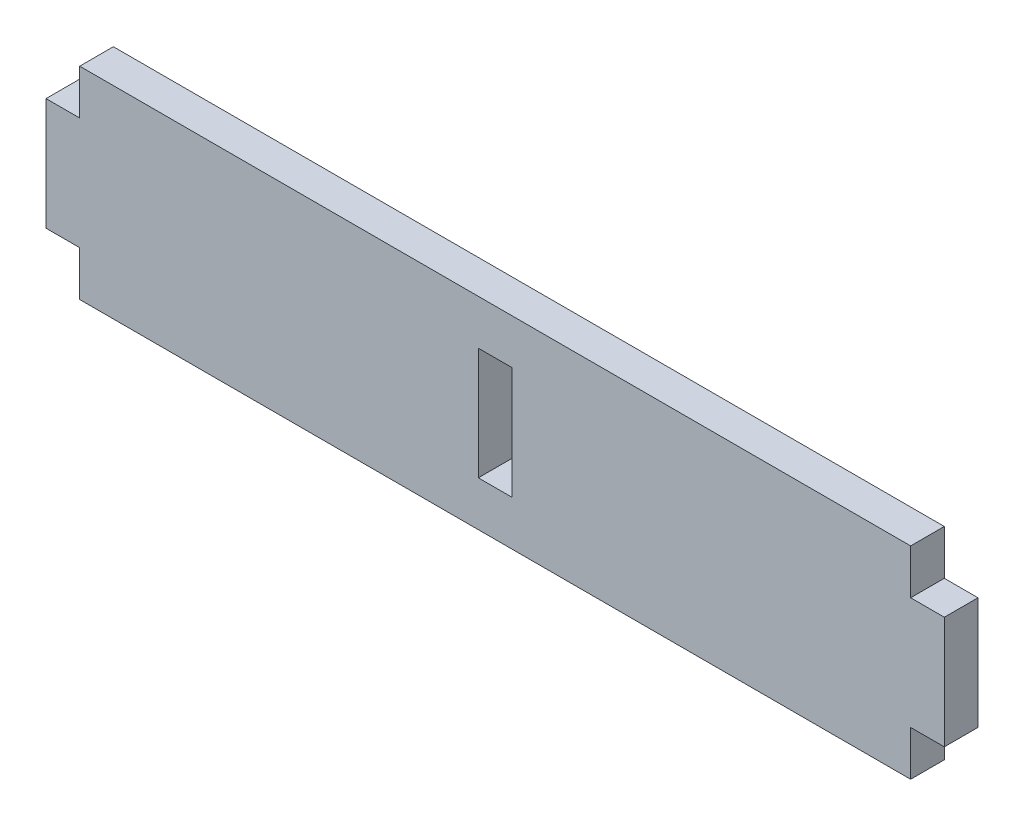
ISO-10303-21;
HEADER;
FILE_DESCRIPTION(('STEP AP214'),'2;1');
FILE_NAME('part.step','',(''),(''),'','','');
FILE_SCHEMA(('AUTOMOTIVE_DESIGN { 1 0 10303 214 1 1 1 1 }'));
ENDSEC;
DATA;
#1=APPLICATION_CONTEXT('core data for automotive mechanical design processes');
#2=APPLICATION_PROTOCOL_DEFINITION('international standard','automotive_design',2000,#1);
#3=PRODUCT_CONTEXT('',#1,'mechanical');
#4=PRODUCT('Part','Part','',(#3));
#5=PRODUCT_RELATED_PRODUCT_CATEGORY('part','',(#4));
#6=PRODUCT_DEFINITION_FORMATION('','',#4);
#7=PRODUCT_DEFINITION_CONTEXT('part definition',#1,'design');
#8=PRODUCT_DEFINITION('design','',#6,#7);
#9=PRODUCT_DEFINITION_SHAPE('','',#8);
#10=(LENGTH_UNIT() NAMED_UNIT(*) SI_UNIT(.MILLI.,.METRE.));
#11=(NAMED_UNIT(*) PLANE_ANGLE_UNIT() SI_UNIT($,.RADIAN.));
#12=(NAMED_UNIT(*) SI_UNIT($,.STERADIAN.) SOLID_ANGLE_UNIT());
#13=UNCERTAINTY_MEASURE_WITH_UNIT(LENGTH_MEASURE(1.E-05),#10,'distance_accuracy_value','');
#14=(GEOMETRIC_REPRESENTATION_CONTEXT(3) GLOBAL_UNCERTAINTY_ASSIGNED_CONTEXT((#13)) GLOBAL_UNIT_ASSIGNED_CONTEXT((#10,
#11,#12)) REPRESENTATION_CONTEXT('',''));
#15=CARTESIAN_POINT('',(0.,0.,0.));
#16=DIRECTION('',(0.,0.,1.));
#17=DIRECTION('',(1.,0.,0.));
#18=AXIS2_PLACEMENT_3D('',#15,#16,#17);
#19=CARTESIAN_POINT('',(0.,5.00000000000001,3.));
#20=DIRECTION('',(0.,-1.,0.));
#21=DIRECTION('',(1.,0.,0.));
#22=AXIS2_PLACEMENT_3D('',#19,#20,#21);
#23=PLANE('',#22);
#24=DIRECTION('',(-1.,0.,0.));
#25=VECTOR('',#24,1.);
#26=CARTESIAN_POINT('',(0.,5.00000000000001,0.));
#27=LINE('',#26,#25);
#28=CARTESIAN_POINT('',(-37.,5.,0.));
#29=VERTEX_POINT('',#28);
#30=CARTESIAN_POINT('',(-40.,5.,0.));
#31=VERTEX_POINT('',#30);
#32=EDGE_CURVE('E179',#29,#31,#27,.T.);
#33=ORIENTED_EDGE('',*,*,#32,.T.);
#34=DIRECTION('',(0.,0.,-1.));
#35=VECTOR('',#34,1.);
#36=CARTESIAN_POINT('',(-40.,5.,3.));
#37=LINE('',#36,#35);
#38=CARTESIAN_POINT('',(-40.,5.,3.));
#39=VERTEX_POINT('',#38);
#40=EDGE_CURVE('E11',#39,#31,#37,.T.);
#41=ORIENTED_EDGE('',*,*,#40,.F.);
#42=DIRECTION('',(-1.,0.,0.));
#43=VECTOR('',#42,1.);
#44=CARTESIAN_POINT('',(0.,5.00000000000001,3.));
#45=LINE('',#44,#43);
#46=CARTESIAN_POINT('',(-37.,5.,3.));
#47=VERTEX_POINT('',#46);
#48=EDGE_CURVE('E183',#47,#39,#45,.T.);
#49=ORIENTED_EDGE('',*,*,#48,.F.);
#50=DIRECTION('',(0.,0.,-1.));
#51=VECTOR('',#50,1.);
#52=CARTESIAN_POINT('',(-37.,5.,3.));
#53=LINE('',#52,#51);
#54=EDGE_CURVE('E241',#47,#29,#53,.T.);
#55=ORIENTED_EDGE('',*,*,#54,.T.);
#56=EDGE_LOOP('',(#33,#41,#49,#55));
#57=FACE_BOUND('',#56,.T.);
#58=ADVANCED_FACE('F34',(#57),#23,.F.);
#59=CARTESIAN_POINT('',(-40.,0.,3.));
#60=DIRECTION('',(1.,0.,0.));
#61=DIRECTION('',(0.,0.,-1.));
#62=AXIS2_PLACEMENT_3D('',#59,#60,#61);
#63=PLANE('',#62);
#64=DIRECTION('',(0.,-1.,0.));
#65=VECTOR('',#64,1.);
#66=CARTESIAN_POINT('',(-40.,0.,0.));
#67=LINE('',#66,#65);
#68=CARTESIAN_POINT('',(-40.,-5.,0.));
#69=VERTEX_POINT('',#68);
#70=EDGE_CURVE('E214',#31,#69,#67,.T.);
#71=ORIENTED_EDGE('',*,*,#70,.T.);
#72=DIRECTION('',(0.,0.,-1.));
#73=VECTOR('',#72,1.);
#74=CARTESIAN_POINT('',(-40.,-5.,3.));
#75=LINE('',#74,#73);
#76=CARTESIAN_POINT('',(-40.,-5.,3.));
#77=VERTEX_POINT('',#76);
#78=EDGE_CURVE('E41',#77,#69,#75,.T.);
#79=ORIENTED_EDGE('',*,*,#78,.F.);
#80=DIRECTION('',(0.,-1.,0.));
#81=VECTOR('',#80,1.);
#82=CARTESIAN_POINT('',(-40.,0.,3.));
#83=LINE('',#82,#81);
#84=EDGE_CURVE('E186',#39,#77,#83,.T.);
#85=ORIENTED_EDGE('',*,*,#84,.F.);
#86=ORIENTED_EDGE('',*,*,#40,.T.);
#87=EDGE_LOOP('',(#71,#79,#85,#86));
#88=FACE_BOUND('',#87,.T.);
#89=ADVANCED_FACE('F268',(#88),#63,.F.);
#90=CARTESIAN_POINT('',(0.,-4.99999999999999,3.));
#91=DIRECTION('',(0.,-1.,0.));
#92=DIRECTION('',(1.,0.,0.));
#93=AXIS2_PLACEMENT_3D('',#90,#91,#92);
#94=PLANE('',#93);
#95=DIRECTION('',(-1.,0.,0.));
#96=VECTOR('',#95,1.);
#97=CARTESIAN_POINT('',(0.,-4.99999999999999,0.));
#98=LINE('',#97,#96);
#99=CARTESIAN_POINT('',(-37.,-5.,0.));
#100=VERTEX_POINT('',#99);
#101=EDGE_CURVE('E217',#100,#69,#98,.T.);
#102=ORIENTED_EDGE('',*,*,#101,.F.);
#103=DIRECTION('',(0.,0.,-1.));
#104=VECTOR('',#103,1.);
#105=CARTESIAN_POINT('',(-37.,-5.,3.));
#106=LINE('',#105,#104);
#107=CARTESIAN_POINT('',(-37.,-5.,3.));
#108=VERTEX_POINT('',#107);
#109=EDGE_CURVE('E261',#108,#100,#106,.T.);
#110=ORIENTED_EDGE('',*,*,#109,.F.);
#111=DIRECTION('',(-1.,0.,0.));
#112=VECTOR('',#111,1.);
#113=CARTESIAN_POINT('',(0.,-4.99999999999999,3.));
#114=LINE('',#113,#112);
#115=EDGE_CURVE('E189',#108,#77,#114,.T.);
#116=ORIENTED_EDGE('',*,*,#115,.T.);
#117=ORIENTED_EDGE('',*,*,#78,.T.);
#118=EDGE_LOOP('',(#102,#110,#116,#117));
#119=FACE_BOUND('',#118,.T.);
#120=ADVANCED_FACE('F265',(#119),#94,.T.);
#121=CARTESIAN_POINT('',(-37.,0.,3.));
#122=DIRECTION('',(1.,0.,0.));
#123=DIRECTION('',(0.,1.,0.));
#124=AXIS2_PLACEMENT_3D('',#121,#122,#123);
#125=PLANE('',#124);
#126=DIRECTION('',(0.,-1.,0.));
#127=VECTOR('',#126,1.);
#128=CARTESIAN_POINT('',(-37.,0.,0.));
#129=LINE('',#128,#127);
#130=CARTESIAN_POINT('',(-37.,-8.99999999999999,0.));
#131=VERTEX_POINT('',#130);
#132=EDGE_CURVE('E220',#100,#131,#129,.T.);
#133=ORIENTED_EDGE('',*,*,#132,.T.);
#134=DIRECTION('',(0.,0.,-1.));
#135=VECTOR('',#134,1.);
#136=CARTESIAN_POINT('',(-37.,-8.99999999999999,3.));
#137=LINE('',#136,#135);
#138=CARTESIAN_POINT('',(-37.,-8.99999999999999,3.));
#139=VERTEX_POINT('',#138);
#140=EDGE_CURVE('E258',#139,#131,#137,.T.);
#141=ORIENTED_EDGE('',*,*,#140,.F.);
#142=DIRECTION('',(0.,-1.,0.));
#143=VECTOR('',#142,1.);
#144=CARTESIAN_POINT('',(-37.,0.,3.));
#145=LINE('',#144,#143);
#146=EDGE_CURVE('E192',#108,#139,#145,.T.);
#147=ORIENTED_EDGE('',*,*,#146,.F.);
#148=ORIENTED_EDGE('',*,*,#109,.T.);
#149=EDGE_LOOP('',(#133,#141,#147,#148));
#150=FACE_BOUND('',#149,.T.);
#151=ADVANCED_FACE('F275',(#150),#125,.F.);
#152=CARTESIAN_POINT('',(0.,-8.99999999999998,3.));
#153=DIRECTION('',(0.,1.,0.));
#154=DIRECTION('',(-1.,0.,0.));
#155=AXIS2_PLACEMENT_3D('',#152,#153,#154);
#156=PLANE('',#155);
#157=DIRECTION('',(1.,0.,0.));
#158=VECTOR('',#157,1.);
#159=CARTESIAN_POINT('',(0.,-8.99999999999998,0.));
#160=LINE('',#159,#158);
#161=CARTESIAN_POINT('',(37.,-8.99999999999998,0.));
#162=VERTEX_POINT('',#161);
#163=EDGE_CURVE('E222',#131,#162,#160,.T.);
#164=ORIENTED_EDGE('',*,*,#163,.T.);
#165=DIRECTION('',(0.,0.,-1.));
#166=VECTOR('',#165,1.);
#167=CARTESIAN_POINT('',(37.,-8.99999999999998,3.));
#168=LINE('',#167,#166);
#169=CARTESIAN_POINT('',(37.,-8.99999999999998,3.));
#170=VERTEX_POINT('',#169);
#171=EDGE_CURVE('E256',#170,#162,#168,.T.);
#172=ORIENTED_EDGE('',*,*,#171,.F.);
#173=DIRECTION('',(1.,0.,0.));
#174=VECTOR('',#173,1.);
#175=CARTESIAN_POINT('',(0.,-8.99999999999998,3.));
#176=LINE('',#175,#174);
#177=EDGE_CURVE('E194',#139,#170,#176,.T.);
#178=ORIENTED_EDGE('',*,*,#177,.F.);
#179=ORIENTED_EDGE('',*,*,#140,.T.);
#180=EDGE_LOOP('',(#164,#172,#178,#179));
#181=FACE_BOUND('',#180,.T.);
#182=ADVANCED_FACE('F279',(#181),#156,.F.);
#183=CARTESIAN_POINT('',(37.,0.,3.));
#184=DIRECTION('',(1.,0.,0.));
#185=DIRECTION('',(0.,0.,-1.));
#186=AXIS2_PLACEMENT_3D('',#183,#184,#185);
#187=PLANE('',#186);
#188=DIRECTION('',(0.,-1.,0.));
#189=VECTOR('',#188,1.);
#190=CARTESIAN_POINT('',(37.,0.,0.));
#191=LINE('',#190,#189);
#192=CARTESIAN_POINT('',(37.,-5.,0.));
#193=VERTEX_POINT('',#192);
#194=EDGE_CURVE('E225',#193,#162,#191,.T.);
#195=ORIENTED_EDGE('',*,*,#194,.F.);
#196=DIRECTION('',(0.,0.,-1.));
#197=VECTOR('',#196,1.);
#198=CARTESIAN_POINT('',(37.,-5.,3.));
#199=LINE('',#198,#197);
#200=CARTESIAN_POINT('',(37.,-5.,3.));
#201=VERTEX_POINT('',#200);
#202=EDGE_CURVE('E254',#201,#193,#199,.T.);
#203=ORIENTED_EDGE('',*,*,#202,.F.);
#204=DIRECTION('',(0.,-1.,0.));
#205=VECTOR('',#204,1.);
#206=CARTESIAN_POINT('',(37.,0.,3.));
#207=LINE('',#206,#205);
#208=EDGE_CURVE('E197',#201,#170,#207,.T.);
#209=ORIENTED_EDGE('',*,*,#208,.T.);
#210=ORIENTED_EDGE('',*,*,#171,.T.);
#211=EDGE_LOOP('',(#195,#203,#209,#210));
#212=FACE_BOUND('',#211,.T.);
#213=ADVANCED_FACE('F315',(#212),#187,.T.);
#214=CARTESIAN_POINT('',(0.,-4.99999999999999,3.));
#215=DIRECTION('',(0.,1.,0.));
#216=DIRECTION('',(-1.,0.,0.));
#217=AXIS2_PLACEMENT_3D('',#214,#215,#216);
#218=PLANE('',#217);
#219=DIRECTION('',(1.,0.,0.));
#220=VECTOR('',#219,1.);
#221=CARTESIAN_POINT('',(0.,-4.99999999999999,0.));
#222=LINE('',#221,#220);
#223=CARTESIAN_POINT('',(40.,-5.,0.));
#224=VERTEX_POINT('',#223);
#225=EDGE_CURVE('E228',#193,#224,#222,.T.);
#226=ORIENTED_EDGE('',*,*,#225,.T.);
#227=DIRECTION('',(0.,0.,-1.));
#228=VECTOR('',#227,1.);
#229=CARTESIAN_POINT('',(40.,-5.,3.));
#230=LINE('',#229,#228);
#231=CARTESIAN_POINT('',(40.,-5.,3.));
#232=VERTEX_POINT('',#231);
#233=EDGE_CURVE('E252',#232,#224,#230,.T.);
#234=ORIENTED_EDGE('',*,*,#233,.F.);
#235=DIRECTION('',(1.,0.,0.));
#236=VECTOR('',#235,1.);
#237=CARTESIAN_POINT('',(0.,-4.99999999999999,3.));
#238=LINE('',#237,#236);
#239=EDGE_CURVE('E200',#201,#232,#238,.T.);
#240=ORIENTED_EDGE('',*,*,#239,.F.);
#241=ORIENTED_EDGE('',*,*,#202,.T.);
#242=EDGE_LOOP('',(#226,#234,#240,#241));
#243=FACE_BOUND('',#242,.T.);
#244=ADVANCED_FACE('F312',(#243),#218,.F.);
#245=CARTESIAN_POINT('',(40.,0.,3.));
#246=DIRECTION('',(1.,0.,0.));
#247=DIRECTION('',(0.,0.,-1.));
#248=AXIS2_PLACEMENT_3D('',#245,#246,#247);
#249=PLANE('',#248);
#250=DIRECTION('',(0.,-1.,0.));
#251=VECTOR('',#250,1.);
#252=CARTESIAN_POINT('',(40.,0.,0.));
#253=LINE('',#252,#251);
#254=CARTESIAN_POINT('',(40.,5.00000000000005,0.));
#255=VERTEX_POINT('',#254);
#256=EDGE_CURVE('E232',#255,#224,#253,.T.);
#257=ORIENTED_EDGE('',*,*,#256,.F.);
#258=DIRECTION('',(0.,0.,-1.));
#259=VECTOR('',#258,1.);
#260=CARTESIAN_POINT('',(40.,5.00000000000005,3.));
#261=LINE('',#260,#259);
#262=CARTESIAN_POINT('',(40.,5.00000000000005,3.));
#263=VERTEX_POINT('',#262);
#264=EDGE_CURVE('E250',#263,#255,#261,.T.);
#265=ORIENTED_EDGE('',*,*,#264,.F.);
#266=DIRECTION('',(0.,-1.,0.));
#267=VECTOR('',#266,1.);
#268=CARTESIAN_POINT('',(40.,0.,3.));
#269=LINE('',#268,#267);
#270=EDGE_CURVE('E203',#263,#232,#269,.T.);
#271=ORIENTED_EDGE('',*,*,#270,.T.);
#272=ORIENTED_EDGE('',*,*,#233,.T.);
#273=EDGE_LOOP('',(#257,#265,#271,#272));
#274=FACE_BOUND('',#273,.T.);
#275=ADVANCED_FACE('F308',(#274),#249,.T.);
#276=CARTESIAN_POINT('',(0.,5.00000000000001,3.));
#277=DIRECTION('',(0.,1.,0.));
#278=DIRECTION('',(-1.,0.,0.));
#279=AXIS2_PLACEMENT_3D('',#276,#277,#278);
#280=PLANE('',#279);
#281=DIRECTION('',(1.,0.,0.));
#282=VECTOR('',#281,1.);
#283=CARTESIAN_POINT('',(0.,5.00000000000001,0.));
#284=LINE('',#283,#282);
#285=CARTESIAN_POINT('',(37.,5.00000000000005,0.));
#286=VERTEX_POINT('',#285);
#287=EDGE_CURVE('E235',#286,#255,#284,.T.);
#288=ORIENTED_EDGE('',*,*,#287,.F.);
#289=DIRECTION('',(0.,0.,-1.));
#290=VECTOR('',#289,1.);
#291=CARTESIAN_POINT('',(37.,5.00000000000005,3.));
#292=LINE('',#291,#290);
#293=CARTESIAN_POINT('',(37.,5.00000000000005,3.));
#294=VERTEX_POINT('',#293);
#295=EDGE_CURVE('E248',#294,#286,#292,.T.);
#296=ORIENTED_EDGE('',*,*,#295,.F.);
#297=DIRECTION('',(1.,0.,0.));
#298=VECTOR('',#297,1.);
#299=CARTESIAN_POINT('',(0.,5.00000000000001,3.));
#300=LINE('',#299,#298);
#301=EDGE_CURVE('E206',#294,#263,#300,.T.);
#302=ORIENTED_EDGE('',*,*,#301,.T.);
#303=ORIENTED_EDGE('',*,*,#264,.T.);
#304=EDGE_LOOP('',(#288,#296,#302,#303));
#305=FACE_BOUND('',#304,.T.);
#306=ADVANCED_FACE('F304',(#305),#280,.T.);
#307=CARTESIAN_POINT('',(37.,8.99999999999999,0.));
#308=VERTEX_POINT('',#307);
#309=EDGE_CURVE('E229',#308,#286,#191,.T.);
#310=ORIENTED_EDGE('',*,*,#309,.F.);
#311=DIRECTION('',(0.,0.,-1.));
#312=VECTOR('',#311,1.);
#313=CARTESIAN_POINT('',(37.,8.99999999999999,3.));
#314=LINE('',#313,#312);
#315=CARTESIAN_POINT('',(37.,8.99999999999999,3.));
#316=VERTEX_POINT('',#315);
#317=EDGE_CURVE('E246',#316,#308,#314,.T.);
#318=ORIENTED_EDGE('',*,*,#317,.F.);
#319=EDGE_CURVE('E201',#316,#294,#207,.T.);
#320=ORIENTED_EDGE('',*,*,#319,.T.);
#321=ORIENTED_EDGE('',*,*,#295,.T.);
#322=EDGE_LOOP('',(#310,#318,#320,#321));
#323=FACE_BOUND('',#322,.T.);
#324=ADVANCED_FACE('F299',(#323),#187,.T.);
#325=CARTESIAN_POINT('',(0.,9.,3.));
#326=DIRECTION('',(0.,1.,0.));
#327=DIRECTION('',(-1.,0.,0.));
#328=AXIS2_PLACEMENT_3D('',#325,#326,#327);
#329=PLANE('',#328);
#330=DIRECTION('',(1.,0.,0.));
#331=VECTOR('',#330,1.);
#332=CARTESIAN_POINT('',(0.,9.,0.));
#333=LINE('',#332,#331);
#334=CARTESIAN_POINT('',(-37.,9.00000000000001,0.));
#335=VERTEX_POINT('',#334);
#336=EDGE_CURVE('E238',#335,#308,#333,.T.);
#337=ORIENTED_EDGE('',*,*,#336,.F.);
#338=DIRECTION('',(0.,0.,-1.));
#339=VECTOR('',#338,1.);
#340=CARTESIAN_POINT('',(-37.,9.00000000000001,3.));
#341=LINE('',#340,#339);
#342=CARTESIAN_POINT('',(-37.,9.00000000000001,3.));
#343=VERTEX_POINT('',#342);
#344=EDGE_CURVE('E244',#343,#335,#341,.T.);
#345=ORIENTED_EDGE('',*,*,#344,.F.);
#346=DIRECTION('',(1.,0.,0.));
#347=VECTOR('',#346,1.);
#348=CARTESIAN_POINT('',(0.,9.,3.));
#349=LINE('',#348,#347);
#350=EDGE_CURVE('E209',#343,#316,#349,.T.);
#351=ORIENTED_EDGE('',*,*,#350,.T.);
#352=ORIENTED_EDGE('',*,*,#317,.T.);
#353=EDGE_LOOP('',(#337,#345,#351,#352));
#354=FACE_BOUND('',#353,.T.);
#355=ADVANCED_FACE('F294',(#354),#329,.T.);
#356=EDGE_CURVE('E187',#335,#29,#129,.T.);
#357=ORIENTED_EDGE('',*,*,#356,.T.);
#358=ORIENTED_EDGE('',*,*,#54,.F.);
#359=EDGE_CURVE('E195',#343,#47,#145,.T.);
#360=ORIENTED_EDGE('',*,*,#359,.F.);
#361=ORIENTED_EDGE('',*,*,#344,.T.);
#362=EDGE_LOOP('',(#357,#358,#360,#361));
#363=FACE_BOUND('',#362,.T.);
#364=ADVANCED_FACE('F352',(#363),#125,.F.);
#365=CARTESIAN_POINT('',(0.,0.,3.));
#366=DIRECTION('',(0.,0.,1.));
#367=DIRECTION('',(1.,0.,0.));
#368=AXIS2_PLACEMENT_3D('',#365,#366,#367);
#369=PLANE('',#368);
#370=DIRECTION('',(0.,1.,0.));
#371=VECTOR('',#370,1.);
#372=CARTESIAN_POINT('',(1.5,5.00000000000003,3.));
#373=LINE('',#372,#371);
#374=CARTESIAN_POINT('',(1.5,-4.99999999999997,3.));
#375=VERTEX_POINT('',#374);
#376=CARTESIAN_POINT('',(1.5,5.00000000000003,3.));
#377=VERTEX_POINT('',#376);
#378=EDGE_CURVE('E48',#375,#377,#373,.T.);
#379=ORIENTED_EDGE('',*,*,#378,.F.);
#380=DIRECTION('',(1.,0.,0.));
#381=VECTOR('',#380,1.);
#382=CARTESIAN_POINT('',(-1.5,-4.99999999999997,3.));
#383=LINE('',#382,#381);
#384=CARTESIAN_POINT('',(-1.5,-4.99999999999997,3.));
#385=VERTEX_POINT('',#384);
#386=EDGE_CURVE('E164',#385,#375,#383,.T.);
#387=ORIENTED_EDGE('',*,*,#386,.F.);
#388=DIRECTION('',(0.,-1.,0.));
#389=VECTOR('',#388,1.);
#390=CARTESIAN_POINT('',(-1.5,5.00000000000003,3.));
#391=LINE('',#390,#389);
#392=CARTESIAN_POINT('',(-1.5,5.00000000000003,3.));
#393=VERTEX_POINT('',#392);
#394=EDGE_CURVE('E167',#393,#385,#391,.T.);
#395=ORIENTED_EDGE('',*,*,#394,.F.);
#396=DIRECTION('',(-1.,0.,0.));
#397=VECTOR('',#396,1.);
#398=CARTESIAN_POINT('',(-1.5,5.00000000000003,3.));
#399=LINE('',#398,#397);
#400=EDGE_CURVE('E173',#377,#393,#399,.T.);
#401=ORIENTED_EDGE('',*,*,#400,.F.);
#402=EDGE_LOOP('',(#379,#387,#395,#401));
#403=FACE_BOUND('',#402,.T.);
#404=ORIENTED_EDGE('',*,*,#48,.T.);
#405=ORIENTED_EDGE('',*,*,#84,.T.);
#406=ORIENTED_EDGE('',*,*,#115,.F.);
#407=ORIENTED_EDGE('',*,*,#146,.T.);
#408=ORIENTED_EDGE('',*,*,#177,.T.);
#409=ORIENTED_EDGE('',*,*,#208,.F.);
#410=ORIENTED_EDGE('',*,*,#239,.T.);
#411=ORIENTED_EDGE('',*,*,#270,.F.);
#412=ORIENTED_EDGE('',*,*,#301,.F.);
#413=ORIENTED_EDGE('',*,*,#319,.F.);
#414=ORIENTED_EDGE('',*,*,#350,.F.);
#415=ORIENTED_EDGE('',*,*,#359,.T.);
#416=EDGE_LOOP('',(#404,#405,#406,#407,#408,#409,#410,#411,#412,#413,#414,#415));
#417=FACE_BOUND('',#416,.T.);
#418=ADVANCED_FACE('F283',(#403,#417),#369,.T.);
#419=CARTESIAN_POINT('',(0.,0.,0.));
#420=DIRECTION('',(0.,0.,1.));
#421=DIRECTION('',(1.,0.,0.));
#422=AXIS2_PLACEMENT_3D('',#419,#420,#421);
#423=PLANE('',#422);
#424=DIRECTION('',(1.,0.,0.));
#425=VECTOR('',#424,1.);
#426=CARTESIAN_POINT('',(-1.5,-4.99999999999997,0.));
#427=LINE('',#426,#425);
#428=CARTESIAN_POINT('',(-1.5,-4.99999999999997,0.));
#429=VERTEX_POINT('',#428);
#430=CARTESIAN_POINT('',(1.5,-4.99999999999997,0.));
#431=VERTEX_POINT('',#430);
#432=EDGE_CURVE('E154',#429,#431,#427,.T.);
#433=ORIENTED_EDGE('',*,*,#432,.T.);
#434=DIRECTION('',(0.,1.,0.));
#435=VECTOR('',#434,1.);
#436=CARTESIAN_POINT('',(1.5,5.00000000000003,0.));
#437=LINE('',#436,#435);
#438=CARTESIAN_POINT('',(1.5,5.00000000000003,0.));
#439=VERTEX_POINT('',#438);
#440=EDGE_CURVE('E148',#431,#439,#437,.T.);
#441=ORIENTED_EDGE('',*,*,#440,.T.);
#442=DIRECTION('',(-1.,0.,0.));
#443=VECTOR('',#442,1.);
#444=CARTESIAN_POINT('',(-1.5,5.00000000000003,0.));
#445=LINE('',#444,#443);
#446=CARTESIAN_POINT('',(-1.5,5.00000000000003,0.));
#447=VERTEX_POINT('',#446);
#448=EDGE_CURVE('E157',#439,#447,#445,.T.);
#449=ORIENTED_EDGE('',*,*,#448,.T.);
#450=DIRECTION('',(0.,-1.,0.));
#451=VECTOR('',#450,1.);
#452=CARTESIAN_POINT('',(-1.5,5.00000000000003,0.));
#453=LINE('',#452,#451);
#454=EDGE_CURVE('E56',#447,#429,#453,.T.);
#455=ORIENTED_EDGE('',*,*,#454,.T.);
#456=EDGE_LOOP('',(#433,#441,#449,#455));
#457=FACE_BOUND('',#456,.T.);
#458=ORIENTED_EDGE('',*,*,#32,.F.);
#459=ORIENTED_EDGE('',*,*,#356,.F.);
#460=ORIENTED_EDGE('',*,*,#336,.T.);
#461=ORIENTED_EDGE('',*,*,#309,.T.);
#462=ORIENTED_EDGE('',*,*,#287,.T.);
#463=ORIENTED_EDGE('',*,*,#256,.T.);
#464=ORIENTED_EDGE('',*,*,#225,.F.);
#465=ORIENTED_EDGE('',*,*,#194,.T.);
#466=ORIENTED_EDGE('',*,*,#163,.F.);
#467=ORIENTED_EDGE('',*,*,#132,.F.);
#468=ORIENTED_EDGE('',*,*,#101,.T.);
#469=ORIENTED_EDGE('',*,*,#70,.F.);
#470=EDGE_LOOP('',(#458,#459,#460,#461,#462,#463,#464,#465,#466,#467,#468,#469));
#471=FACE_BOUND('',#470,.T.);
#472=ADVANCED_FACE('F161',(#457,#471),#423,.F.);
#473=CARTESIAN_POINT('',(1.5,5.00000000000003,0.));
#474=DIRECTION('',(1.,0.,0.));
#475=DIRECTION('',(0.,1.,0.));
#476=AXIS2_PLACEMENT_3D('',#473,#474,#475);
#477=PLANE('',#476);
#478=ORIENTED_EDGE('',*,*,#378,.T.);
#479=DIRECTION('',(0.,0.,1.));
#480=VECTOR('',#479,1.);
#481=CARTESIAN_POINT('',(1.5,5.00000000000003,0.));
#482=LINE('',#481,#480);
#483=EDGE_CURVE('E144',#439,#377,#482,.T.);
#484=ORIENTED_EDGE('',*,*,#483,.F.);
#485=ORIENTED_EDGE('',*,*,#440,.F.);
#486=DIRECTION('',(0.,0.,1.));
#487=VECTOR('',#486,1.);
#488=CARTESIAN_POINT('',(1.5,-4.99999999999997,0.));
#489=LINE('',#488,#487);
#490=EDGE_CURVE('E177',#431,#375,#489,.T.);
#491=ORIENTED_EDGE('',*,*,#490,.T.);
#492=EDGE_LOOP('',(#478,#484,#485,#491));
#493=FACE_BOUND('',#492,.T.);
#494=ADVANCED_FACE('F146',(#493),#477,.F.);
#495=CARTESIAN_POINT('',(-1.5,-4.99999999999997,0.));
#496=DIRECTION('',(0.,-1.,0.));
#497=DIRECTION('',(0.,0.,-1.));
#498=AXIS2_PLACEMENT_3D('',#495,#496,#497);
#499=PLANE('',#498);
#500=ORIENTED_EDGE('',*,*,#386,.T.);
#501=ORIENTED_EDGE('',*,*,#490,.F.);
#502=ORIENTED_EDGE('',*,*,#432,.F.);
#503=DIRECTION('',(0.,0.,1.));
#504=VECTOR('',#503,1.);
#505=CARTESIAN_POINT('',(-1.5,-4.99999999999997,0.));
#506=LINE('',#505,#504);
#507=EDGE_CURVE('E180',#429,#385,#506,.T.);
#508=ORIENTED_EDGE('',*,*,#507,.T.);
#509=EDGE_LOOP('',(#500,#501,#502,#508));
#510=FACE_BOUND('',#509,.T.);
#511=ADVANCED_FACE('F377',(#510),#499,.F.);
#512=CARTESIAN_POINT('',(-1.5,5.00000000000003,0.));
#513=DIRECTION('',(-1.,0.,0.));
#514=DIRECTION('',(0.,-1.,0.));
#515=AXIS2_PLACEMENT_3D('',#512,#513,#514);
#516=PLANE('',#515);
#517=ORIENTED_EDGE('',*,*,#394,.T.);
#518=ORIENTED_EDGE('',*,*,#507,.F.);
#519=ORIENTED_EDGE('',*,*,#454,.F.);
#520=DIRECTION('',(0.,0.,1.));
#521=VECTOR('',#520,1.);
#522=CARTESIAN_POINT('',(-1.5,5.00000000000003,0.));
#523=LINE('',#522,#521);
#524=EDGE_CURVE('E153',#447,#393,#523,.T.);
#525=ORIENTED_EDGE('',*,*,#524,.T.);
#526=EDGE_LOOP('',(#517,#518,#519,#525));
#527=FACE_BOUND('',#526,.T.);
#528=ADVANCED_FACE('F384',(#527),#516,.F.);
#529=CARTESIAN_POINT('',(-1.5,5.00000000000003,0.));
#530=DIRECTION('',(0.,1.,0.));
#531=DIRECTION('',(0.,0.,1.));
#532=AXIS2_PLACEMENT_3D('',#529,#530,#531);
#533=PLANE('',#532);
#534=ORIENTED_EDGE('',*,*,#400,.T.);
#535=ORIENTED_EDGE('',*,*,#524,.F.);
#536=ORIENTED_EDGE('',*,*,#448,.F.);
#537=ORIENTED_EDGE('',*,*,#483,.T.);
#538=EDGE_LOOP('',(#534,#535,#536,#537));
#539=FACE_BOUND('',#538,.T.);
#540=ADVANCED_FACE('F158',(#539),#533,.F.);
#541=CLOSED_SHELL('',(#58,#89,#120,#151,#182,#213,#244,#275,#306,#324,#355,#364,#418,#472,#494,
#511,#528,#540));
#542=MANIFOLD_SOLID_BREP('B2',#541);
#543=ADVANCED_BREP_SHAPE_REPRESENTATION('',(#18,#542),#14);
#544=SHAPE_DEFINITION_REPRESENTATION(#9,#543);
ENDSEC;
END-ISO-10303-21;
